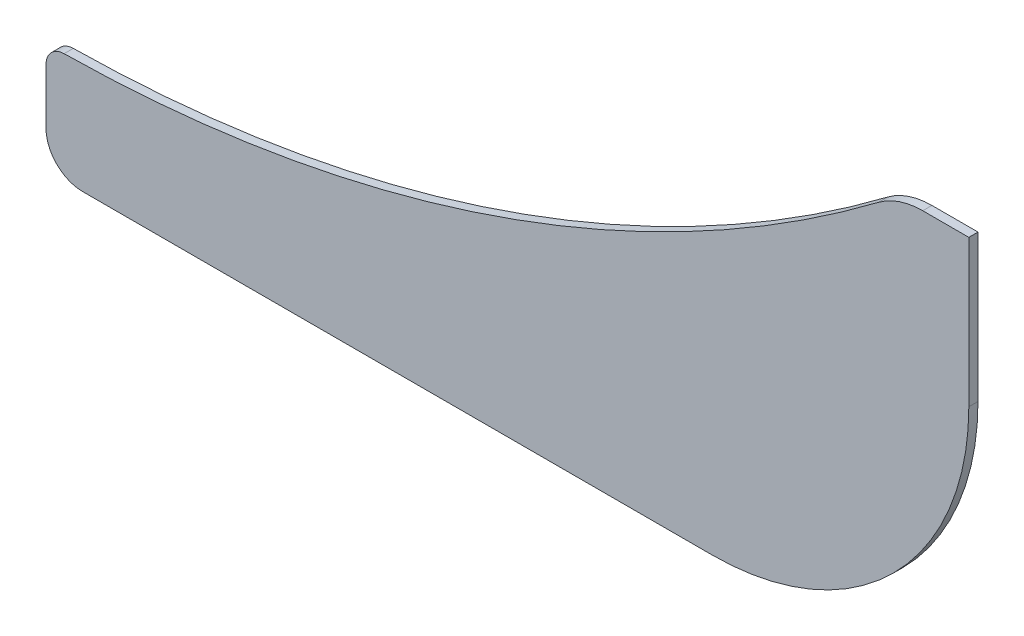
ISO-10303-21;
HEADER;
FILE_DESCRIPTION(('STEP AP214'),'2;1');
FILE_NAME('part.step','',(''),(''),'','','');
FILE_SCHEMA(('AUTOMOTIVE_DESIGN { 1 0 10303 214 1 1 1 1 }'));
ENDSEC;
DATA;
#1=APPLICATION_CONTEXT('core data for automotive mechanical design processes');
#2=APPLICATION_PROTOCOL_DEFINITION('international standard','automotive_design',2000,#1);
#3=PRODUCT_CONTEXT('',#1,'mechanical');
#4=PRODUCT('Part','Part','',(#3));
#5=PRODUCT_RELATED_PRODUCT_CATEGORY('part','',(#4));
#6=PRODUCT_DEFINITION_FORMATION('','',#4);
#7=PRODUCT_DEFINITION_CONTEXT('part definition',#1,'design');
#8=PRODUCT_DEFINITION('design','',#6,#7);
#9=PRODUCT_DEFINITION_SHAPE('','',#8);
#10=(LENGTH_UNIT() NAMED_UNIT(*) SI_UNIT(.MILLI.,.METRE.));
#11=(NAMED_UNIT(*) PLANE_ANGLE_UNIT() SI_UNIT($,.RADIAN.));
#12=(NAMED_UNIT(*) SI_UNIT($,.STERADIAN.) SOLID_ANGLE_UNIT());
#13=UNCERTAINTY_MEASURE_WITH_UNIT(LENGTH_MEASURE(1.E-05),#10,'distance_accuracy_value','');
#14=(GEOMETRIC_REPRESENTATION_CONTEXT(3) GLOBAL_UNCERTAINTY_ASSIGNED_CONTEXT((#13)) GLOBAL_UNIT_ASSIGNED_CONTEXT((#10,
#11,#12)) REPRESENTATION_CONTEXT('',''));
#15=CARTESIAN_POINT('',(0.,0.,0.));
#16=DIRECTION('',(0.,0.,1.));
#17=DIRECTION('',(1.,0.,0.));
#18=AXIS2_PLACEMENT_3D('',#15,#16,#17);
#19=CARTESIAN_POINT('',(0.,-7.62000000000008,6.35));
#20=DIRECTION('',(0.,-1.,0.));
#21=DIRECTION('',(1.,0.,0.));
#22=AXIS2_PLACEMENT_3D('',#19,#20,#21);
#23=PLANE('',#22);
#24=DIRECTION('',(-1.,0.,0.));
#25=VECTOR('',#24,1.);
#26=CARTESIAN_POINT('',(0.,-7.62000000000008,0.));
#27=LINE('',#26,#25);
#28=CARTESIAN_POINT('',(562.84881144586,-7.61999999999996,0.));
#29=VERTEX_POINT('',#28);
#30=CARTESIAN_POINT('',(530.929220686222,-7.61999999999997,0.));
#31=VERTEX_POINT('',#30);
#32=EDGE_CURVE('E129',#29,#31,#27,.T.);
#33=ORIENTED_EDGE('',*,*,#32,.T.);
#34=DIRECTION('',(0.,0.,-1.));
#35=VECTOR('',#34,1.);
#36=CARTESIAN_POINT('',(530.929220686222,-7.61999999999997,6.35));
#37=LINE('',#36,#35);
#38=CARTESIAN_POINT('',(530.929220686222,-7.61999999999997,6.35));
#39=VERTEX_POINT('',#38);
#40=EDGE_CURVE('E110',#39,#31,#37,.T.);
#41=ORIENTED_EDGE('',*,*,#40,.F.);
#42=DIRECTION('',(-1.,0.,0.));
#43=VECTOR('',#42,1.);
#44=CARTESIAN_POINT('',(0.,-7.62000000000008,6.35));
#45=LINE('',#44,#43);
#46=CARTESIAN_POINT('',(562.84881144586,-7.61999999999996,6.35));
#47=VERTEX_POINT('',#46);
#48=EDGE_CURVE('E116',#47,#39,#45,.T.);
#49=ORIENTED_EDGE('',*,*,#48,.F.);
#50=DIRECTION('',(0.,0.,-1.));
#51=VECTOR('',#50,1.);
#52=CARTESIAN_POINT('',(562.84881144586,-7.61999999999996,6.35));
#53=LINE('',#52,#51);
#54=EDGE_CURVE('E147',#47,#29,#53,.T.);
#55=ORIENTED_EDGE('',*,*,#54,.T.);
#56=EDGE_LOOP('',(#33,#41,#49,#55));
#57=FACE_BOUND('',#56,.T.);
#58=ADVANCED_FACE('F35',(#57),#23,.F.);
#59=CARTESIAN_POINT('',(530.929220686222,-58.4199999999999,6.35));
#60=DIRECTION('',(0.,0.,-1.));
#61=DIRECTION('',(-1.,0.,0.));
#62=AXIS2_PLACEMENT_3D('',#59,#60,#61);
#63=CYLINDRICAL_SURFACE('',#62,50.8);
#64=CARTESIAN_POINT('',(530.929220686222,-58.4199999999999,0.));
#65=DIRECTION('',(0.,0.,1.));
#66=DIRECTION('',(1.,0.,0.));
#67=AXIS2_PLACEMENT_3D('',#64,#65,#66);
#68=CIRCLE('',#67,50.8);
#69=CARTESIAN_POINT('',(500.350118614954,-17.8545156997363,0.));
#70=VERTEX_POINT('',#69);
#71=EDGE_CURVE('E162',#31,#70,#68,.T.);
#72=ORIENTED_EDGE('',*,*,#71,.T.);
#73=DIRECTION('',(0.,0.,-1.));
#74=VECTOR('',#73,1.);
#75=CARTESIAN_POINT('',(500.350118614954,-17.8545156997363,6.35));
#76=LINE('',#75,#74);
#77=CARTESIAN_POINT('',(500.350118614954,-17.8545156997363,6.35));
#78=VERTEX_POINT('',#77);
#79=EDGE_CURVE('E113',#78,#70,#76,.T.);
#80=ORIENTED_EDGE('',*,*,#79,.F.);
#81=CARTESIAN_POINT('',(530.929220686222,-58.4199999999999,6.35));
#82=DIRECTION('',(0.,0.,1.));
#83=DIRECTION('',(1.,0.,0.));
#84=AXIS2_PLACEMENT_3D('',#81,#82,#83);
#85=CIRCLE('',#84,50.8);
#86=EDGE_CURVE('E105',#39,#78,#85,.T.);
#87=ORIENTED_EDGE('',*,*,#86,.F.);
#88=ORIENTED_EDGE('',*,*,#40,.T.);
#89=EDGE_LOOP('',(#72,#80,#87,#88));
#90=FACE_BOUND('',#89,.T.);
#91=ADVANCED_FACE('F108',(#90),#63,.T.);
#92=CARTESIAN_POINT('',(-76.2000000000001,746.982683590206,6.35));
#93=DIRECTION('',(0.,0.,-1.));
#94=DIRECTION('',(-1.,0.,0.));
#95=AXIS2_PLACEMENT_3D('',#92,#93,#94);
#96=CYLINDRICAL_SURFACE('',#95,957.802683590206);
#97=CARTESIAN_POINT('',(-76.2000000000001,746.982683590206,0.));
#98=DIRECTION('',(0.,0.,1.));
#99=DIRECTION('',(1.,0.,0.));
#100=AXIS2_PLACEMENT_3D('',#97,#98,#99);
#101=CIRCLE('',#100,957.802683590206);
#102=CARTESIAN_POINT('',(-63.666192224635,-210.737987772405,0.));
#103=VERTEX_POINT('',#102);
#104=EDGE_CURVE('E160',#103,#70,#101,.T.);
#105=ORIENTED_EDGE('',*,*,#104,.F.);
#106=DIRECTION('',(0.,0.,-1.));
#107=VECTOR('',#106,1.);
#108=CARTESIAN_POINT('',(-63.666192224635,-210.737987772405,6.35));
#109=LINE('',#108,#107);
#110=CARTESIAN_POINT('',(-63.666192224635,-210.737987772405,6.35));
#111=VERTEX_POINT('',#110);
#112=EDGE_CURVE('E43',#103,#111,#109,.F.);
#113=ORIENTED_EDGE('',*,*,#112,.T.);
#114=CARTESIAN_POINT('',(-76.2000000000001,746.982683590206,6.35));
#115=DIRECTION('',(0.,0.,1.));
#116=DIRECTION('',(1.,0.,0.));
#117=AXIS2_PLACEMENT_3D('',#114,#115,#116);
#118=CIRCLE('',#117,957.802683590206);
#119=EDGE_CURVE('E115',#111,#78,#118,.T.);
#120=ORIENTED_EDGE('',*,*,#119,.T.);
#121=ORIENTED_EDGE('',*,*,#79,.T.);
#122=EDGE_LOOP('',(#105,#113,#120,#121));
#123=FACE_BOUND('',#122,.T.);
#124=ADVANCED_FACE('F175',(#123),#96,.F.);
#125=CARTESIAN_POINT('',(-76.200000000001,-2.91433543964107E-13,6.35));
#126=DIRECTION('',(1.,0.,0.));
#127=DIRECTION('',(0.,1.,0.));
#128=AXIS2_PLACEMENT_3D('',#125,#126,#127);
#129=PLANE('',#128);
#130=DIRECTION('',(0.,-1.,0.));
#131=VECTOR('',#130,1.);
#132=CARTESIAN_POINT('',(-76.200000000001,-2.91433543964107E-13,6.35));
#133=LINE('',#132,#131);
#134=CARTESIAN_POINT('',(-76.2000000000001,-223.436900329962,6.35));
#135=VERTEX_POINT('',#134);
#136=CARTESIAN_POINT('',(-76.2,-261.62,6.35));
#137=VERTEX_POINT('',#136);
#138=EDGE_CURVE('E173',#135,#137,#133,.T.);
#139=ORIENTED_EDGE('',*,*,#138,.F.);
#140=DIRECTION('',(0.,0.,1.));
#141=VECTOR('',#140,1.);
#142=CARTESIAN_POINT('',(-76.2000000000001,-223.436900329962,0.));
#143=LINE('',#142,#141);
#144=CARTESIAN_POINT('',(-76.2000000000001,-223.436900329962,0.));
#145=VERTEX_POINT('',#144);
#146=EDGE_CURVE('E130',#135,#145,#143,.F.);
#147=ORIENTED_EDGE('',*,*,#146,.T.);
#148=DIRECTION('',(0.,-1.,0.));
#149=VECTOR('',#148,1.);
#150=CARTESIAN_POINT('',(-76.200000000001,-2.91433543964107E-13,0.));
#151=LINE('',#150,#149);
#152=CARTESIAN_POINT('',(-76.2,-261.62,0.));
#153=VERTEX_POINT('',#152);
#154=EDGE_CURVE('E158',#145,#153,#151,.T.);
#155=ORIENTED_EDGE('',*,*,#154,.T.);
#156=DIRECTION('',(0.,0.,-1.));
#157=VECTOR('',#156,1.);
#158=CARTESIAN_POINT('',(-76.2,-261.62,6.35));
#159=LINE('',#158,#157);
#160=EDGE_CURVE('E134',#137,#153,#159,.T.);
#161=ORIENTED_EDGE('',*,*,#160,.F.);
#162=EDGE_LOOP('',(#139,#147,#155,#161));
#163=FACE_BOUND('',#162,.T.);
#164=ADVANCED_FACE('F181',(#163),#129,.F.);
#165=CARTESIAN_POINT('',(-50.8,-261.62,6.35));
#166=DIRECTION('',(0.,0.,-1.));
#167=DIRECTION('',(-1.,0.,0.));
#168=AXIS2_PLACEMENT_3D('',#165,#166,#167);
#169=CYLINDRICAL_SURFACE('',#168,25.4);
#170=CARTESIAN_POINT('',(-50.8,-261.62,0.));
#171=DIRECTION('',(0.,0.,1.));
#172=DIRECTION('',(1.,0.,0.));
#173=AXIS2_PLACEMENT_3D('',#170,#171,#172);
#174=CIRCLE('',#173,25.4);
#175=CARTESIAN_POINT('',(-50.8,-287.02,0.));
#176=VERTEX_POINT('',#175);
#177=EDGE_CURVE('E156',#153,#176,#174,.T.);
#178=ORIENTED_EDGE('',*,*,#177,.T.);
#179=DIRECTION('',(0.,0.,-1.));
#180=VECTOR('',#179,1.);
#181=CARTESIAN_POINT('',(-50.8,-287.02,6.35));
#182=LINE('',#181,#180);
#183=CARTESIAN_POINT('',(-50.8,-287.02,6.35));
#184=VERTEX_POINT('',#183);
#185=EDGE_CURVE('E140',#184,#176,#182,.T.);
#186=ORIENTED_EDGE('',*,*,#185,.F.);
#187=CARTESIAN_POINT('',(-50.8,-261.62,6.35));
#188=DIRECTION('',(0.,0.,1.));
#189=DIRECTION('',(1.,0.,0.));
#190=AXIS2_PLACEMENT_3D('',#187,#188,#189);
#191=CIRCLE('',#190,25.4);
#192=EDGE_CURVE('E171',#137,#184,#191,.T.);
#193=ORIENTED_EDGE('',*,*,#192,.F.);
#194=ORIENTED_EDGE('',*,*,#160,.T.);
#195=EDGE_LOOP('',(#178,#186,#193,#194));
#196=FACE_BOUND('',#195,.T.);
#197=ADVANCED_FACE('F188',(#196),#169,.T.);
#198=CARTESIAN_POINT('',(0.,-287.02,6.35));
#199=DIRECTION('',(0.,1.,0.));
#200=DIRECTION('',(-1.,0.,0.));
#201=AXIS2_PLACEMENT_3D('',#198,#199,#200);
#202=PLANE('',#201);
#203=DIRECTION('',(1.,0.,0.));
#204=VECTOR('',#203,1.);
#205=CARTESIAN_POINT('',(0.,-287.02,0.));
#206=LINE('',#205,#204);
#207=CARTESIAN_POINT('',(385.04881144586,-287.02,0.));
#208=VERTEX_POINT('',#207);
#209=EDGE_CURVE('E153',#176,#208,#206,.T.);
#210=ORIENTED_EDGE('',*,*,#209,.T.);
#211=DIRECTION('',(0.,0.,-1.));
#212=VECTOR('',#211,1.);
#213=CARTESIAN_POINT('',(385.04881144586,-287.02,6.35));
#214=LINE('',#213,#212);
#215=CARTESIAN_POINT('',(385.04881144586,-287.02,6.35));
#216=VERTEX_POINT('',#215);
#217=EDGE_CURVE('E143',#216,#208,#214,.T.);
#218=ORIENTED_EDGE('',*,*,#217,.F.);
#219=DIRECTION('',(1.,0.,0.));
#220=VECTOR('',#219,1.);
#221=CARTESIAN_POINT('',(0.,-287.02,6.35));
#222=LINE('',#221,#220);
#223=EDGE_CURVE('E169',#184,#216,#222,.T.);
#224=ORIENTED_EDGE('',*,*,#223,.F.);
#225=ORIENTED_EDGE('',*,*,#185,.T.);
#226=EDGE_LOOP('',(#210,#218,#224,#225));
#227=FACE_BOUND('',#226,.T.);
#228=ADVANCED_FACE('F192',(#227),#202,.F.);
#229=CARTESIAN_POINT('',(385.04881144586,-109.22,6.35));
#230=DIRECTION('',(0.,0.,-1.));
#231=DIRECTION('',(-1.,0.,0.));
#232=AXIS2_PLACEMENT_3D('',#229,#230,#231);
#233=CYLINDRICAL_SURFACE('',#232,177.8);
#234=CARTESIAN_POINT('',(385.04881144586,-109.22,0.));
#235=DIRECTION('',(0.,0.,1.));
#236=DIRECTION('',(1.,0.,0.));
#237=AXIS2_PLACEMENT_3D('',#234,#235,#236);
#238=CIRCLE('',#237,177.8);
#239=CARTESIAN_POINT('',(562.84881144586,-109.22,0.));
#240=VERTEX_POINT('',#239);
#241=EDGE_CURVE('E150',#240,#208,#238,.F.);
#242=ORIENTED_EDGE('',*,*,#241,.F.);
#243=DIRECTION('',(0.,0.,-1.));
#244=VECTOR('',#243,1.);
#245=CARTESIAN_POINT('',(562.84881144586,-109.22,6.35));
#246=LINE('',#245,#244);
#247=CARTESIAN_POINT('',(562.84881144586,-109.22,6.35));
#248=VERTEX_POINT('',#247);
#249=EDGE_CURVE('E145',#248,#240,#246,.T.);
#250=ORIENTED_EDGE('',*,*,#249,.F.);
#251=CARTESIAN_POINT('',(385.04881144586,-109.22,6.35));
#252=DIRECTION('',(0.,0.,1.));
#253=DIRECTION('',(1.,0.,0.));
#254=AXIS2_PLACEMENT_3D('',#251,#252,#253);
#255=CIRCLE('',#254,177.8);
#256=EDGE_CURVE('E166',#248,#216,#255,.F.);
#257=ORIENTED_EDGE('',*,*,#256,.T.);
#258=ORIENTED_EDGE('',*,*,#217,.T.);
#259=EDGE_LOOP('',(#242,#250,#257,#258));
#260=FACE_BOUND('',#259,.T.);
#261=ADVANCED_FACE('F196',(#260),#233,.T.);
#262=CARTESIAN_POINT('',(562.84881144586,-6.15046958513875E-13,6.35));
#263=DIRECTION('',(-1.,0.,0.));
#264=DIRECTION('',(0.,-1.,0.));
#265=AXIS2_PLACEMENT_3D('',#262,#263,#264);
#266=PLANE('',#265);
#267=DIRECTION('',(0.,1.,0.));
#268=VECTOR('',#267,1.);
#269=CARTESIAN_POINT('',(562.84881144586,-6.15046958513875E-13,0.));
#270=LINE('',#269,#268);
#271=EDGE_CURVE('E126',#240,#29,#270,.T.);
#272=ORIENTED_EDGE('',*,*,#271,.T.);
#273=ORIENTED_EDGE('',*,*,#54,.F.);
#274=DIRECTION('',(0.,1.,0.));
#275=VECTOR('',#274,1.);
#276=CARTESIAN_POINT('',(562.84881144586,-6.15046958513875E-13,6.35));
#277=LINE('',#276,#275);
#278=EDGE_CURVE('E122',#248,#47,#277,.T.);
#279=ORIENTED_EDGE('',*,*,#278,.F.);
#280=ORIENTED_EDGE('',*,*,#249,.T.);
#281=EDGE_LOOP('',(#272,#273,#279,#280));
#282=FACE_BOUND('',#281,.T.);
#283=ADVANCED_FACE('F199',(#282),#266,.F.);
#284=CARTESIAN_POINT('',(0.,0.,6.35));
#285=DIRECTION('',(0.,0.,1.));
#286=DIRECTION('',(1.,0.,0.));
#287=AXIS2_PLACEMENT_3D('',#284,#285,#286);
#288=PLANE('',#287);
#289=ORIENTED_EDGE('',*,*,#119,.F.);
#290=CARTESIAN_POINT('',(-63.5000000000001,-223.436900329962,6.35));
#291=DIRECTION('',(0.,0.,1.));
#292=DIRECTION('',(1.,0.,0.));
#293=AXIS2_PLACEMENT_3D('',#290,#291,#292);
#294=CIRCLE('',#293,12.7);
#295=EDGE_CURVE('E11',#111,#135,#294,.T.);
#296=ORIENTED_EDGE('',*,*,#295,.T.);
#297=ORIENTED_EDGE('',*,*,#138,.T.);
#298=ORIENTED_EDGE('',*,*,#192,.T.);
#299=ORIENTED_EDGE('',*,*,#223,.T.);
#300=ORIENTED_EDGE('',*,*,#256,.F.);
#301=ORIENTED_EDGE('',*,*,#278,.T.);
#302=ORIENTED_EDGE('',*,*,#48,.T.);
#303=ORIENTED_EDGE('',*,*,#86,.T.);
#304=EDGE_LOOP('',(#289,#296,#297,#298,#299,#300,#301,#302,#303));
#305=FACE_BOUND('',#304,.T.);
#306=ADVANCED_FACE('F119',(#305),#288,.T.);
#307=CARTESIAN_POINT('',(0.,0.,0.));
#308=DIRECTION('',(0.,0.,1.));
#309=DIRECTION('',(1.,0.,0.));
#310=AXIS2_PLACEMENT_3D('',#307,#308,#309);
#311=PLANE('',#310);
#312=ORIENTED_EDGE('',*,*,#154,.F.);
#313=CARTESIAN_POINT('',(-63.5000000000001,-223.436900329962,0.));
#314=DIRECTION('',(0.,0.,1.));
#315=DIRECTION('',(1.,0.,0.));
#316=AXIS2_PLACEMENT_3D('',#313,#314,#315);
#317=CIRCLE('',#316,12.7);
#318=EDGE_CURVE('E57',#145,#103,#317,.F.);
#319=ORIENTED_EDGE('',*,*,#318,.T.);
#320=ORIENTED_EDGE('',*,*,#104,.T.);
#321=ORIENTED_EDGE('',*,*,#71,.F.);
#322=ORIENTED_EDGE('',*,*,#32,.F.);
#323=ORIENTED_EDGE('',*,*,#271,.F.);
#324=ORIENTED_EDGE('',*,*,#241,.T.);
#325=ORIENTED_EDGE('',*,*,#209,.F.);
#326=ORIENTED_EDGE('',*,*,#177,.F.);
#327=EDGE_LOOP('',(#312,#319,#320,#321,#322,#323,#324,#325,#326));
#328=FACE_BOUND('',#327,.T.);
#329=ADVANCED_FACE('F184',(#328),#311,.F.);
#330=CARTESIAN_POINT('',(-63.5000000000001,-223.436900329962,6.35));
#331=DIRECTION('',(0.,0.,-1.));
#332=DIRECTION('',(-1.,0.,0.));
#333=AXIS2_PLACEMENT_3D('',#330,#331,#332);
#334=CYLINDRICAL_SURFACE('',#333,12.7);
#335=ORIENTED_EDGE('',*,*,#295,.F.);
#336=ORIENTED_EDGE('',*,*,#112,.F.);
#337=ORIENTED_EDGE('',*,*,#318,.F.);
#338=ORIENTED_EDGE('',*,*,#146,.F.);
#339=EDGE_LOOP('',(#335,#336,#337,#338));
#340=FACE_BOUND('',#339,.T.);
#341=ADVANCED_FACE('F37',(#340),#334,.T.);
#342=CLOSED_SHELL('',(#58,#91,#124,#164,#197,#228,#261,#283,#306,#329,#341));
#343=MANIFOLD_SOLID_BREP('B2',#342);
#344=ADVANCED_BREP_SHAPE_REPRESENTATION('',(#18,#343),#14);
#345=SHAPE_DEFINITION_REPRESENTATION(#9,#344);
ENDSEC;
END-ISO-10303-21;
